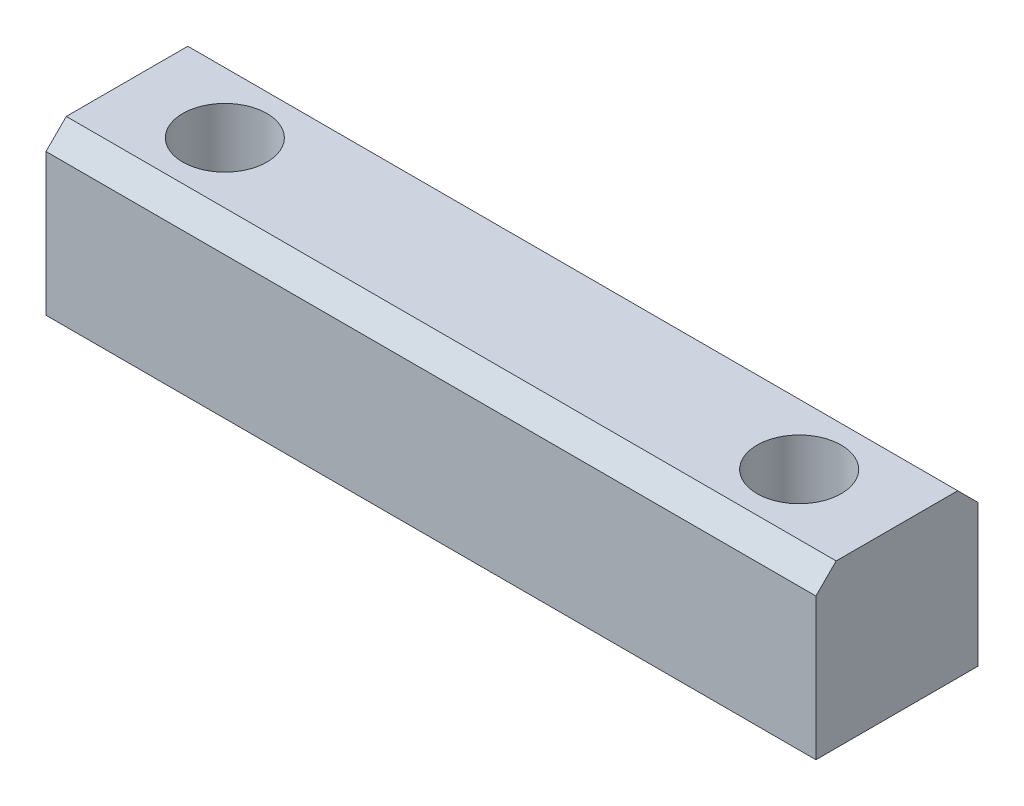
ISO-10303-21;
HEADER;
FILE_DESCRIPTION(('STEP AP214'),'2;1');
FILE_NAME('part.step','',(''),(''),'','','');
FILE_SCHEMA(('AUTOMOTIVE_DESIGN { 1 0 10303 214 1 1 1 1 }'));
ENDSEC;
DATA;
#1=APPLICATION_CONTEXT('core data for automotive mechanical design processes');
#2=APPLICATION_PROTOCOL_DEFINITION('international standard','automotive_design',2000,#1);
#3=PRODUCT_CONTEXT('',#1,'mechanical');
#4=PRODUCT('Part','Part','',(#3));
#5=PRODUCT_RELATED_PRODUCT_CATEGORY('part','',(#4));
#6=PRODUCT_DEFINITION_FORMATION('','',#4);
#7=PRODUCT_DEFINITION_CONTEXT('part definition',#1,'design');
#8=PRODUCT_DEFINITION('design','',#6,#7);
#9=PRODUCT_DEFINITION_SHAPE('','',#8);
#10=(LENGTH_UNIT() NAMED_UNIT(*) SI_UNIT(.MILLI.,.METRE.));
#11=(NAMED_UNIT(*) PLANE_ANGLE_UNIT() SI_UNIT($,.RADIAN.));
#12=(NAMED_UNIT(*) SI_UNIT($,.STERADIAN.) SOLID_ANGLE_UNIT());
#13=UNCERTAINTY_MEASURE_WITH_UNIT(LENGTH_MEASURE(1.E-05),#10,'distance_accuracy_value','');
#14=(GEOMETRIC_REPRESENTATION_CONTEXT(3) GLOBAL_UNCERTAINTY_ASSIGNED_CONTEXT((#13)) GLOBAL_UNIT_ASSIGNED_CONTEXT((#10,
#11,#12)) REPRESENTATION_CONTEXT('',''));
#15=CARTESIAN_POINT('',(0.,0.,0.));
#16=DIRECTION('',(0.,0.,1.));
#17=DIRECTION('',(1.,0.,0.));
#18=AXIS2_PLACEMENT_3D('',#15,#16,#17);
#19=CARTESIAN_POINT('',(30.1625,6.35,6.35));
#20=DIRECTION('',(0.,0.,-1.));
#21=DIRECTION('',(-1.,0.,0.));
#22=AXIS2_PLACEMENT_3D('',#19,#20,#21);
#23=PLANE('',#22);
#24=DIRECTION('',(0.,-1.,0.));
#25=VECTOR('',#24,1.);
#26=CARTESIAN_POINT('',(30.1625,6.35,6.35));
#27=LINE('',#26,#25);
#28=CARTESIAN_POINT('',(30.1625,4.76250000000001,6.35));
#29=VERTEX_POINT('',#28);
#30=CARTESIAN_POINT('',(30.1625,-6.35,6.35));
#31=VERTEX_POINT('',#30);
#32=EDGE_CURVE('E89',#29,#31,#27,.T.);
#33=ORIENTED_EDGE('',*,*,#32,.F.);
#34=DIRECTION('',(-1.,0.,0.));
#35=VECTOR('',#34,1.);
#36=CARTESIAN_POINT('',(30.1625,4.76250000000001,6.35));
#37=LINE('',#36,#35);
#38=CARTESIAN_POINT('',(-30.1625,4.76250000000001,6.35));
#39=VERTEX_POINT('',#38);
#40=EDGE_CURVE('E11',#29,#39,#37,.T.);
#41=ORIENTED_EDGE('',*,*,#40,.T.);
#42=DIRECTION('',(0.,-1.,0.));
#43=VECTOR('',#42,1.);
#44=CARTESIAN_POINT('',(-30.1625,6.35,6.35));
#45=LINE('',#44,#43);
#46=CARTESIAN_POINT('',(-30.1625,-6.35,6.35));
#47=VERTEX_POINT('',#46);
#48=EDGE_CURVE('E108',#39,#47,#45,.T.);
#49=ORIENTED_EDGE('',*,*,#48,.T.);
#50=DIRECTION('',(-1.,0.,0.));
#51=VECTOR('',#50,1.);
#52=CARTESIAN_POINT('',(30.1625,-6.35,6.35));
#53=LINE('',#52,#51);
#54=EDGE_CURVE('E102',#31,#47,#53,.T.);
#55=ORIENTED_EDGE('',*,*,#54,.F.);
#56=EDGE_LOOP('',(#33,#41,#49,#55));
#57=FACE_BOUND('',#56,.T.);
#58=ADVANCED_FACE('F36',(#57),#23,.F.);
#59=CARTESIAN_POINT('',(30.1625,-6.35,6.35));
#60=DIRECTION('',(0.,1.,0.));
#61=DIRECTION('',(0.,0.,1.));
#62=AXIS2_PLACEMENT_3D('',#59,#60,#61);
#63=PLANE('',#62);
#64=CARTESIAN_POINT('',(-22.5,-6.34999999999999,0.));
#65=DIRECTION('',(0.,1.,0.));
#66=DIRECTION('',(0.,0.,1.));
#67=AXIS2_PLACEMENT_3D('',#64,#65,#66);
#68=CIRCLE('',#67,3.29999999999997);
#69=CARTESIAN_POINT('',(-22.5,-6.34999999999999,3.29999999999997));
#70=VERTEX_POINT('',#69);
#71=EDGE_CURVE('E153',#70,#70,#68,.T.);
#72=ORIENTED_EDGE('',*,*,#71,.T.);
#73=EDGE_LOOP('',(#72));
#74=FACE_BOUND('',#73,.T.);
#75=CARTESIAN_POINT('',(22.5,-6.34999999999999,0.));
#76=DIRECTION('',(0.,1.,0.));
#77=DIRECTION('',(0.,0.,1.));
#78=AXIS2_PLACEMENT_3D('',#75,#76,#77);
#79=CIRCLE('',#78,3.29999999999997);
#80=CARTESIAN_POINT('',(22.5,-6.34999999999999,3.29999999999997));
#81=VERTEX_POINT('',#80);
#82=EDGE_CURVE('E145',#81,#81,#79,.T.);
#83=ORIENTED_EDGE('',*,*,#82,.T.);
#84=EDGE_LOOP('',(#83));
#85=FACE_BOUND('',#84,.T.);
#86=DIRECTION('',(0.,0.,-1.));
#87=VECTOR('',#86,1.);
#88=CARTESIAN_POINT('',(-30.1625,-6.35,6.35));
#89=LINE('',#88,#87);
#90=CARTESIAN_POINT('',(-30.1625,-6.35,-6.35));
#91=VERTEX_POINT('',#90);
#92=EDGE_CURVE('E141',#47,#91,#89,.T.);
#93=ORIENTED_EDGE('',*,*,#92,.T.);
#94=DIRECTION('',(-1.,0.,0.));
#95=VECTOR('',#94,1.);
#96=CARTESIAN_POINT('',(30.1625,-6.35,-6.35));
#97=LINE('',#96,#95);
#98=CARTESIAN_POINT('',(30.1625,-6.35,-6.35));
#99=VERTEX_POINT('',#98);
#100=EDGE_CURVE('E104',#99,#91,#97,.T.);
#101=ORIENTED_EDGE('',*,*,#100,.F.);
#102=DIRECTION('',(0.,0.,-1.));
#103=VECTOR('',#102,1.);
#104=CARTESIAN_POINT('',(30.1625,-6.35,6.35));
#105=LINE('',#104,#103);
#106=EDGE_CURVE('E92',#31,#99,#105,.T.);
#107=ORIENTED_EDGE('',*,*,#106,.F.);
#108=ORIENTED_EDGE('',*,*,#54,.T.);
#109=EDGE_LOOP('',(#93,#101,#107,#108));
#110=FACE_BOUND('',#109,.T.);
#111=ADVANCED_FACE('F101',(#74,#85,#110),#63,.F.);
#112=CARTESIAN_POINT('',(30.1625,6.35,-6.35));
#113=DIRECTION('',(0.,0.,1.));
#114=DIRECTION('',(1.,0.,0.));
#115=AXIS2_PLACEMENT_3D('',#112,#113,#114);
#116=PLANE('',#115);
#117=DIRECTION('',(0.,1.,0.));
#118=VECTOR('',#117,1.);
#119=CARTESIAN_POINT('',(-30.1625,6.35,-6.35));
#120=LINE('',#119,#118);
#121=CARTESIAN_POINT('',(-30.1625,4.7625,-6.35));
#122=VERTEX_POINT('',#121);
#123=EDGE_CURVE('E139',#91,#122,#120,.T.);
#124=ORIENTED_EDGE('',*,*,#123,.T.);
#125=DIRECTION('',(1.,0.,0.));
#126=VECTOR('',#125,1.);
#127=CARTESIAN_POINT('',(30.1625,4.7625,-6.35));
#128=LINE('',#127,#126);
#129=CARTESIAN_POINT('',(30.1625,4.7625,-6.35));
#130=VERTEX_POINT('',#129);
#131=EDGE_CURVE('E59',#122,#130,#128,.T.);
#132=ORIENTED_EDGE('',*,*,#131,.T.);
#133=DIRECTION('',(0.,1.,0.));
#134=VECTOR('',#133,1.);
#135=CARTESIAN_POINT('',(30.1625,6.35,-6.35));
#136=LINE('',#135,#134);
#137=EDGE_CURVE('E105',#99,#130,#136,.T.);
#138=ORIENTED_EDGE('',*,*,#137,.F.);
#139=ORIENTED_EDGE('',*,*,#100,.T.);
#140=EDGE_LOOP('',(#124,#132,#138,#139));
#141=FACE_BOUND('',#140,.T.);
#142=ADVANCED_FACE('F140',(#141),#116,.F.);
#143=CARTESIAN_POINT('',(30.1625,6.35,6.35));
#144=DIRECTION('',(0.,-1.,0.));
#145=DIRECTION('',(0.,0.,-1.));
#146=AXIS2_PLACEMENT_3D('',#143,#144,#145);
#147=PLANE('',#146);
#148=CARTESIAN_POINT('',(-22.5,6.35,0.));
#149=DIRECTION('',(0.,1.,0.));
#150=DIRECTION('',(0.,0.,1.));
#151=AXIS2_PLACEMENT_3D('',#148,#149,#150);
#152=CIRCLE('',#151,3.29999999999999);
#153=CARTESIAN_POINT('',(-22.5,6.35,3.29999999999999));
#154=VERTEX_POINT('',#153);
#155=EDGE_CURVE('E156',#154,#154,#152,.T.);
#156=ORIENTED_EDGE('',*,*,#155,.F.);
#157=EDGE_LOOP('',(#156));
#158=FACE_BOUND('',#157,.T.);
#159=CARTESIAN_POINT('',(22.5,6.35,0.));
#160=DIRECTION('',(0.,1.,0.));
#161=DIRECTION('',(0.,0.,1.));
#162=AXIS2_PLACEMENT_3D('',#159,#160,#161);
#163=CIRCLE('',#162,3.29999999999999);
#164=CARTESIAN_POINT('',(22.5,6.35,3.29999999999999));
#165=VERTEX_POINT('',#164);
#166=EDGE_CURVE('E150',#165,#165,#163,.T.);
#167=ORIENTED_EDGE('',*,*,#166,.F.);
#168=EDGE_LOOP('',(#167));
#169=FACE_BOUND('',#168,.T.);
#170=DIRECTION('',(0.,0.,1.));
#171=VECTOR('',#170,1.);
#172=CARTESIAN_POINT('',(30.1625,6.35,6.35));
#173=LINE('',#172,#171);
#174=CARTESIAN_POINT('',(30.1625,6.35,-4.7625));
#175=VERTEX_POINT('',#174);
#176=CARTESIAN_POINT('',(30.1625,6.35,4.7625));
#177=VERTEX_POINT('',#176);
#178=EDGE_CURVE('E114',#175,#177,#173,.T.);
#179=ORIENTED_EDGE('',*,*,#178,.F.);
#180=DIRECTION('',(-1.,0.,0.));
#181=VECTOR('',#180,1.);
#182=CARTESIAN_POINT('',(30.1625,6.35,-4.7625));
#183=LINE('',#182,#181);
#184=CARTESIAN_POINT('',(-30.1625,6.35,-4.7625));
#185=VERTEX_POINT('',#184);
#186=EDGE_CURVE('E112',#175,#185,#183,.T.);
#187=ORIENTED_EDGE('',*,*,#186,.T.);
#188=DIRECTION('',(0.,0.,1.));
#189=VECTOR('',#188,1.);
#190=CARTESIAN_POINT('',(-30.1625,6.35,6.35));
#191=LINE('',#190,#189);
#192=CARTESIAN_POINT('',(-30.1625,6.35,4.7625));
#193=VERTEX_POINT('',#192);
#194=EDGE_CURVE('E97',#185,#193,#191,.T.);
#195=ORIENTED_EDGE('',*,*,#194,.T.);
#196=DIRECTION('',(1.,0.,0.));
#197=VECTOR('',#196,1.);
#198=CARTESIAN_POINT('',(30.1625,6.35,4.7625));
#199=LINE('',#198,#197);
#200=EDGE_CURVE('E110',#193,#177,#199,.T.);
#201=ORIENTED_EDGE('',*,*,#200,.T.);
#202=EDGE_LOOP('',(#179,#187,#195,#201));
#203=FACE_BOUND('',#202,.T.);
#204=ADVANCED_FACE('F130',(#158,#169,#203),#147,.F.);
#205=CARTESIAN_POINT('',(30.1625,0.,0.));
#206=DIRECTION('',(1.,0.,0.));
#207=DIRECTION('',(0.,0.,-1.));
#208=AXIS2_PLACEMENT_3D('',#205,#206,#207);
#209=PLANE('',#208);
#210=ORIENTED_EDGE('',*,*,#137,.T.);
#211=DIRECTION('',(0.,-0.707106781186549,-0.707106781186547));
#212=VECTOR('',#211,1.);
#213=CARTESIAN_POINT('',(30.1625,5.55624999999999,-5.55625000000001));
#214=LINE('',#213,#212);
#215=EDGE_CURVE('E44',#130,#175,#214,.F.);
#216=ORIENTED_EDGE('',*,*,#215,.T.);
#217=ORIENTED_EDGE('',*,*,#178,.T.);
#218=DIRECTION('',(0.,0.707106781186546,-0.707106781186549));
#219=VECTOR('',#218,1.);
#220=CARTESIAN_POINT('',(30.1625,5.55625000000002,5.55624999999999));
#221=LINE('',#220,#219);
#222=EDGE_CURVE('E51',#177,#29,#221,.F.);
#223=ORIENTED_EDGE('',*,*,#222,.T.);
#224=ORIENTED_EDGE('',*,*,#32,.T.);
#225=ORIENTED_EDGE('',*,*,#106,.T.);
#226=EDGE_LOOP('',(#210,#216,#217,#223,#224,#225));
#227=FACE_BOUND('',#226,.T.);
#228=ADVANCED_FACE('F91',(#227),#209,.T.);
#229=CARTESIAN_POINT('',(-30.1625,0.,0.));
#230=DIRECTION('',(1.,0.,0.));
#231=DIRECTION('',(0.,0.,-1.));
#232=AXIS2_PLACEMENT_3D('',#229,#230,#231);
#233=PLANE('',#232);
#234=ORIENTED_EDGE('',*,*,#194,.F.);
#235=DIRECTION('',(0.,0.707106781186549,0.707106781186547));
#236=VECTOR('',#235,1.);
#237=CARTESIAN_POINT('',(-30.1625,6.35,-4.7625));
#238=LINE('',#237,#236);
#239=EDGE_CURVE('E122',#185,#122,#238,.F.);
#240=ORIENTED_EDGE('',*,*,#239,.T.);
#241=ORIENTED_EDGE('',*,*,#123,.F.);
#242=ORIENTED_EDGE('',*,*,#92,.F.);
#243=ORIENTED_EDGE('',*,*,#48,.F.);
#244=DIRECTION('',(0.,-0.707106781186546,0.707106781186549));
#245=VECTOR('',#244,1.);
#246=CARTESIAN_POINT('',(-30.1625,4.76250000000001,6.35));
#247=LINE('',#246,#245);
#248=EDGE_CURVE('E120',#39,#193,#247,.F.);
#249=ORIENTED_EDGE('',*,*,#248,.T.);
#250=EDGE_LOOP('',(#234,#240,#241,#242,#243,#249));
#251=FACE_BOUND('',#250,.T.);
#252=ADVANCED_FACE('F138',(#251),#233,.F.);
#253=CARTESIAN_POINT('',(22.5,6.35,0.));
#254=DIRECTION('',(0.,1.,0.));
#255=DIRECTION('',(0.,0.,1.));
#256=AXIS2_PLACEMENT_3D('',#253,#254,#255);
#257=CYLINDRICAL_SURFACE('',#256,3.29999999999998);
#258=ORIENTED_EDGE('',*,*,#82,.F.);
#259=EDGE_LOOP('',(#258));
#260=FACE_BOUND('',#259,.T.);
#261=ORIENTED_EDGE('',*,*,#166,.T.);
#262=EDGE_LOOP('',(#261));
#263=FACE_BOUND('',#262,.T.);
#264=ADVANCED_FACE('F167',(#260,#263),#257,.F.);
#265=CARTESIAN_POINT('',(-22.5,6.35,0.));
#266=DIRECTION('',(0.,1.,0.));
#267=DIRECTION('',(0.,0.,1.));
#268=AXIS2_PLACEMENT_3D('',#265,#266,#267);
#269=CYLINDRICAL_SURFACE('',#268,3.29999999999998);
#270=ORIENTED_EDGE('',*,*,#71,.F.);
#271=EDGE_LOOP('',(#270));
#272=FACE_BOUND('',#271,.T.);
#273=ORIENTED_EDGE('',*,*,#155,.T.);
#274=EDGE_LOOP('',(#273));
#275=FACE_BOUND('',#274,.T.);
#276=ADVANCED_FACE('F160',(#272,#275),#269,.F.);
#277=CARTESIAN_POINT('',(30.1625,6.35,-4.7625));
#278=DIRECTION('',(0.,-0.707106781186546,0.707106781186548));
#279=DIRECTION('',(-1.,0.,0.));
#280=AXIS2_PLACEMENT_3D('',#277,#278,#279);
#281=PLANE('',#280);
#282=ORIENTED_EDGE('',*,*,#215,.F.);
#283=ORIENTED_EDGE('',*,*,#131,.F.);
#284=ORIENTED_EDGE('',*,*,#239,.F.);
#285=ORIENTED_EDGE('',*,*,#186,.F.);
#286=EDGE_LOOP('',(#282,#283,#284,#285));
#287=FACE_BOUND('',#286,.T.);
#288=ADVANCED_FACE('F135',(#287),#281,.F.);
#289=CARTESIAN_POINT('',(30.1625,4.76250000000001,6.35));
#290=DIRECTION('',(0.,-0.707106781186549,-0.707106781186546));
#291=DIRECTION('',(-1.,0.,0.));
#292=AXIS2_PLACEMENT_3D('',#289,#290,#291);
#293=PLANE('',#292);
#294=ORIENTED_EDGE('',*,*,#222,.F.);
#295=ORIENTED_EDGE('',*,*,#200,.F.);
#296=ORIENTED_EDGE('',*,*,#248,.F.);
#297=ORIENTED_EDGE('',*,*,#40,.F.);
#298=EDGE_LOOP('',(#294,#295,#296,#297));
#299=FACE_BOUND('',#298,.T.);
#300=ADVANCED_FACE('F38',(#299),#293,.F.);
#301=CLOSED_SHELL('',(#58,#111,#142,#204,#228,#252,#264,#276,#288,#300));
#302=MANIFOLD_SOLID_BREP('B2',#301);
#303=ADVANCED_BREP_SHAPE_REPRESENTATION('',(#18,#302),#14);
#304=SHAPE_DEFINITION_REPRESENTATION(#9,#303);
ENDSEC;
END-ISO-10303-21;
